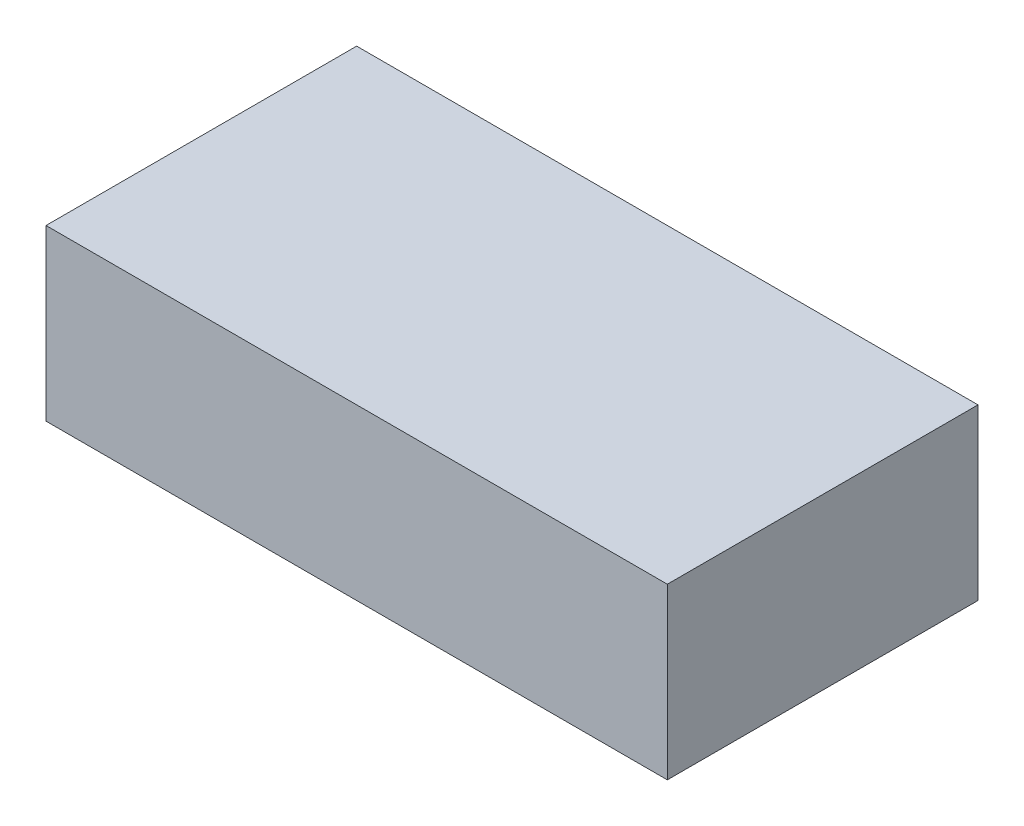
ISO-10303-21;
HEADER;
FILE_DESCRIPTION(('STEP AP214'),'2;1');
FILE_NAME('part.step','',(''),(''),'','','');
FILE_SCHEMA(('AUTOMOTIVE_DESIGN { 1 0 10303 214 1 1 1 1 }'));
ENDSEC;
DATA;
#1=APPLICATION_CONTEXT('core data for automotive mechanical design processes');
#2=APPLICATION_PROTOCOL_DEFINITION('international standard','automotive_design',2000,#1);
#3=PRODUCT_CONTEXT('',#1,'mechanical');
#4=PRODUCT('Part','Part','',(#3));
#5=PRODUCT_RELATED_PRODUCT_CATEGORY('part','',(#4));
#6=PRODUCT_DEFINITION_FORMATION('','',#4);
#7=PRODUCT_DEFINITION_CONTEXT('part definition',#1,'design');
#8=PRODUCT_DEFINITION('design','',#6,#7);
#9=PRODUCT_DEFINITION_SHAPE('','',#8);
#10=(LENGTH_UNIT() NAMED_UNIT(*) SI_UNIT(.MILLI.,.METRE.));
#11=(NAMED_UNIT(*) PLANE_ANGLE_UNIT() SI_UNIT($,.RADIAN.));
#12=(NAMED_UNIT(*) SI_UNIT($,.STERADIAN.) SOLID_ANGLE_UNIT());
#13=UNCERTAINTY_MEASURE_WITH_UNIT(LENGTH_MEASURE(1.E-05),#10,'distance_accuracy_value','');
#14=(GEOMETRIC_REPRESENTATION_CONTEXT(3) GLOBAL_UNCERTAINTY_ASSIGNED_CONTEXT((#13)) GLOBAL_UNIT_ASSIGNED_CONTEXT((#10,
#11,#12)) REPRESENTATION_CONTEXT('',''));
#15=CARTESIAN_POINT('',(0.,0.,0.));
#16=DIRECTION('',(0.,0.,1.));
#17=DIRECTION('',(1.,0.,0.));
#18=AXIS2_PLACEMENT_3D('',#15,#16,#17);
#19=CARTESIAN_POINT('',(55.,30.,-27.5));
#20=DIRECTION('',(-1.,0.,0.));
#21=DIRECTION('',(0.,0.,1.));
#22=AXIS2_PLACEMENT_3D('',#19,#20,#21);
#23=PLANE('',#22);
#24=DIRECTION('',(0.,0.,-1.));
#25=VECTOR('',#24,1.);
#26=CARTESIAN_POINT('',(55.,0.,-27.5));
#27=LINE('',#26,#25);
#28=CARTESIAN_POINT('',(55.,0.,27.5));
#29=VERTEX_POINT('',#28);
#30=CARTESIAN_POINT('',(55.,0.,-27.5));
#31=VERTEX_POINT('',#30);
#32=EDGE_CURVE('E97',#29,#31,#27,.T.);
#33=ORIENTED_EDGE('',*,*,#32,.T.);
#34=DIRECTION('',(0.,-1.,0.));
#35=VECTOR('',#34,1.);
#36=CARTESIAN_POINT('',(55.,30.,-27.5));
#37=LINE('',#36,#35);
#38=CARTESIAN_POINT('',(55.,30.,-27.5));
#39=VERTEX_POINT('',#38);
#40=EDGE_CURVE('E11',#39,#31,#37,.T.);
#41=ORIENTED_EDGE('',*,*,#40,.F.);
#42=DIRECTION('',(0.,0.,-1.));
#43=VECTOR('',#42,1.);
#44=CARTESIAN_POINT('',(55.,30.,-27.5));
#45=LINE('',#44,#43);
#46=CARTESIAN_POINT('',(55.,30.,27.5));
#47=VERTEX_POINT('',#46);
#48=EDGE_CURVE('E85',#47,#39,#45,.T.);
#49=ORIENTED_EDGE('',*,*,#48,.F.);
#50=DIRECTION('',(0.,-1.,0.));
#51=VECTOR('',#50,1.);
#52=CARTESIAN_POINT('',(55.,30.,27.5));
#53=LINE('',#52,#51);
#54=EDGE_CURVE('E93',#47,#29,#53,.T.);
#55=ORIENTED_EDGE('',*,*,#54,.T.);
#56=EDGE_LOOP('',(#33,#41,#49,#55));
#57=FACE_BOUND('',#56,.T.);
#58=ADVANCED_FACE('F34',(#57),#23,.F.);
#59=CARTESIAN_POINT('',(-55.,30.,-27.5));
#60=DIRECTION('',(0.,0.,1.));
#61=DIRECTION('',(1.,0.,0.));
#62=AXIS2_PLACEMENT_3D('',#59,#60,#61);
#63=PLANE('',#62);
#64=DIRECTION('',(-1.,0.,0.));
#65=VECTOR('',#64,1.);
#66=CARTESIAN_POINT('',(-55.,0.,-27.5));
#67=LINE('',#66,#65);
#68=CARTESIAN_POINT('',(-55.,0.,-27.5));
#69=VERTEX_POINT('',#68);
#70=EDGE_CURVE('E89',#31,#69,#67,.T.);
#71=ORIENTED_EDGE('',*,*,#70,.T.);
#72=DIRECTION('',(0.,-1.,0.));
#73=VECTOR('',#72,1.);
#74=CARTESIAN_POINT('',(-55.,30.,-27.5));
#75=LINE('',#74,#73);
#76=CARTESIAN_POINT('',(-55.,30.,-27.5));
#77=VERTEX_POINT('',#76);
#78=EDGE_CURVE('E42',#77,#69,#75,.T.);
#79=ORIENTED_EDGE('',*,*,#78,.F.);
#80=DIRECTION('',(-1.,0.,0.));
#81=VECTOR('',#80,1.);
#82=CARTESIAN_POINT('',(-55.,30.,-27.5));
#83=LINE('',#82,#81);
#84=EDGE_CURVE('E80',#39,#77,#83,.T.);
#85=ORIENTED_EDGE('',*,*,#84,.F.);
#86=ORIENTED_EDGE('',*,*,#40,.T.);
#87=EDGE_LOOP('',(#71,#79,#85,#86));
#88=FACE_BOUND('',#87,.T.);
#89=ADVANCED_FACE('F88',(#88),#63,.F.);
#90=CARTESIAN_POINT('',(-55.,30.,-27.5));
#91=DIRECTION('',(1.,0.,0.));
#92=DIRECTION('',(0.,0.,-1.));
#93=AXIS2_PLACEMENT_3D('',#90,#91,#92);
#94=PLANE('',#93);
#95=DIRECTION('',(0.,0.,1.));
#96=VECTOR('',#95,1.);
#97=CARTESIAN_POINT('',(-55.,0.,-27.5));
#98=LINE('',#97,#96);
#99=CARTESIAN_POINT('',(-55.,0.,27.5));
#100=VERTEX_POINT('',#99);
#101=EDGE_CURVE('E67',#69,#100,#98,.T.);
#102=ORIENTED_EDGE('',*,*,#101,.T.);
#103=DIRECTION('',(0.,-1.,0.));
#104=VECTOR('',#103,1.);
#105=CARTESIAN_POINT('',(-55.,30.,27.5));
#106=LINE('',#105,#104);
#107=CARTESIAN_POINT('',(-55.,30.,27.5));
#108=VERTEX_POINT('',#107);
#109=EDGE_CURVE('E90',#108,#100,#106,.T.);
#110=ORIENTED_EDGE('',*,*,#109,.F.);
#111=DIRECTION('',(0.,0.,1.));
#112=VECTOR('',#111,1.);
#113=CARTESIAN_POINT('',(-55.,30.,-27.5));
#114=LINE('',#113,#112);
#115=EDGE_CURVE('E83',#77,#108,#114,.T.);
#116=ORIENTED_EDGE('',*,*,#115,.F.);
#117=ORIENTED_EDGE('',*,*,#78,.T.);
#118=EDGE_LOOP('',(#102,#110,#116,#117));
#119=FACE_BOUND('',#118,.T.);
#120=ADVANCED_FACE('F91',(#119),#94,.F.);
#121=CARTESIAN_POINT('',(-55.,30.,27.5));
#122=DIRECTION('',(0.,0.,-1.));
#123=DIRECTION('',(-1.,0.,0.));
#124=AXIS2_PLACEMENT_3D('',#121,#122,#123);
#125=PLANE('',#124);
#126=DIRECTION('',(1.,0.,0.));
#127=VECTOR('',#126,1.);
#128=CARTESIAN_POINT('',(-55.,0.,27.5));
#129=LINE('',#128,#127);
#130=EDGE_CURVE('E73',#100,#29,#129,.T.);
#131=ORIENTED_EDGE('',*,*,#130,.T.);
#132=ORIENTED_EDGE('',*,*,#54,.F.);
#133=DIRECTION('',(1.,0.,0.));
#134=VECTOR('',#133,1.);
#135=CARTESIAN_POINT('',(-55.,30.,27.5));
#136=LINE('',#135,#134);
#137=EDGE_CURVE('E50',#108,#47,#136,.T.);
#138=ORIENTED_EDGE('',*,*,#137,.F.);
#139=ORIENTED_EDGE('',*,*,#109,.T.);
#140=EDGE_LOOP('',(#131,#132,#138,#139));
#141=FACE_BOUND('',#140,.T.);
#142=ADVANCED_FACE('F104',(#141),#125,.F.);
#143=CARTESIAN_POINT('',(0.,30.,0.));
#144=DIRECTION('',(0.,1.,0.));
#145=DIRECTION('',(0.,0.,1.));
#146=AXIS2_PLACEMENT_3D('',#143,#144,#145);
#147=PLANE('',#146);
#148=ORIENTED_EDGE('',*,*,#48,.T.);
#149=ORIENTED_EDGE('',*,*,#84,.T.);
#150=ORIENTED_EDGE('',*,*,#115,.T.);
#151=ORIENTED_EDGE('',*,*,#137,.T.);
#152=EDGE_LOOP('',(#148,#149,#150,#151));
#153=FACE_BOUND('',#152,.T.);
#154=ADVANCED_FACE('F81',(#153),#147,.T.);
#155=CARTESIAN_POINT('',(0.,0.,0.));
#156=DIRECTION('',(0.,1.,0.));
#157=DIRECTION('',(0.,0.,1.));
#158=AXIS2_PLACEMENT_3D('',#155,#156,#157);
#159=PLANE('',#158);
#160=ORIENTED_EDGE('',*,*,#32,.F.);
#161=ORIENTED_EDGE('',*,*,#130,.F.);
#162=ORIENTED_EDGE('',*,*,#101,.F.);
#163=ORIENTED_EDGE('',*,*,#70,.F.);
#164=EDGE_LOOP('',(#160,#161,#162,#163));
#165=FACE_BOUND('',#164,.T.);
#166=ADVANCED_FACE('F107',(#165),#159,.F.);
#167=CLOSED_SHELL('',(#58,#89,#120,#142,#154,#166));
#168=MANIFOLD_SOLID_BREP('B2',#167);
#169=ADVANCED_BREP_SHAPE_REPRESENTATION('',(#18,#168),#14);
#170=SHAPE_DEFINITION_REPRESENTATION(#9,#169);
ENDSEC;
END-ISO-10303-21;
